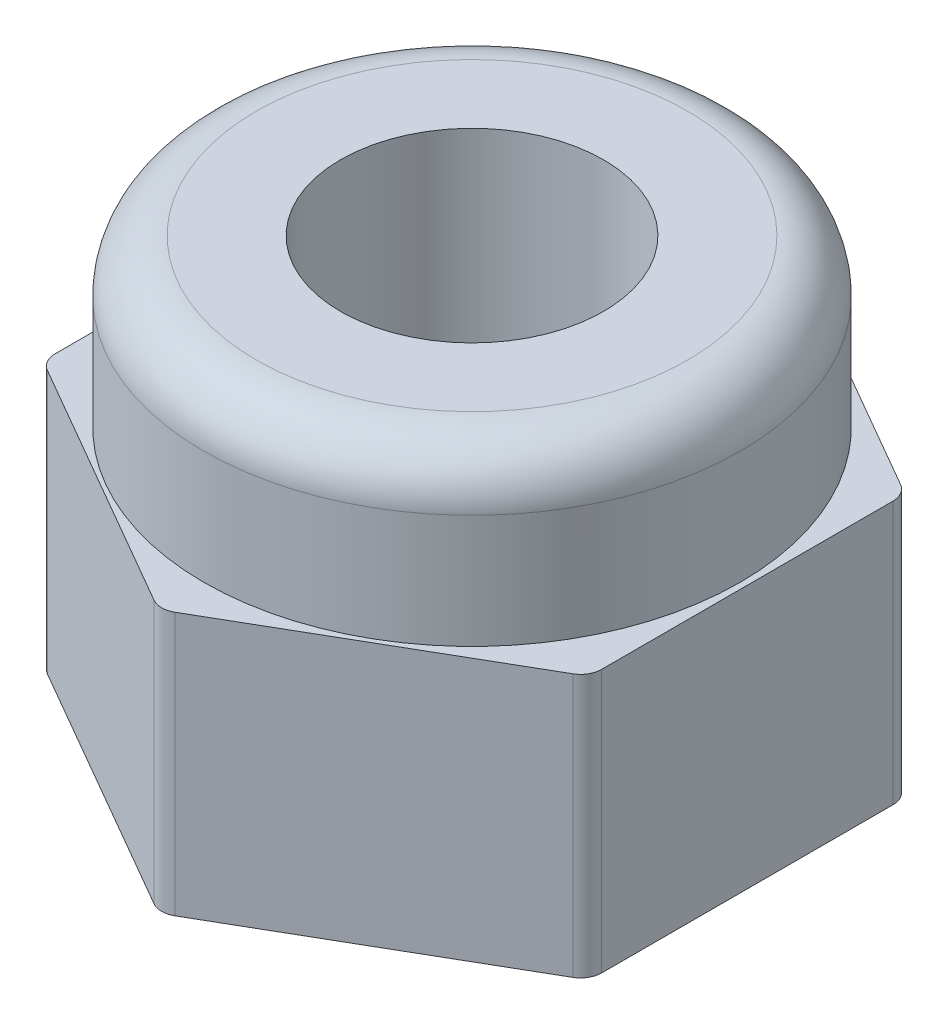
ISO-10303-21;
HEADER;
FILE_DESCRIPTION(('STEP AP214'),'2;1');
FILE_NAME('part.step','',(''),(''),'','','');
FILE_SCHEMA(('AUTOMOTIVE_DESIGN { 1 0 10303 214 1 1 1 1 }'));
ENDSEC;
DATA;
#1=APPLICATION_CONTEXT('core data for automotive mechanical design processes');
#2=APPLICATION_PROTOCOL_DEFINITION('international standard','automotive_design',2000,#1);
#3=PRODUCT_CONTEXT('',#1,'mechanical');
#4=PRODUCT('Part','Part','',(#3));
#5=PRODUCT_RELATED_PRODUCT_CATEGORY('part','',(#4));
#6=PRODUCT_DEFINITION_FORMATION('','',#4);
#7=PRODUCT_DEFINITION_CONTEXT('part definition',#1,'design');
#8=PRODUCT_DEFINITION('design','',#6,#7);
#9=PRODUCT_DEFINITION_SHAPE('','',#8);
#10=(LENGTH_UNIT() NAMED_UNIT(*) SI_UNIT(.MILLI.,.METRE.));
#11=(NAMED_UNIT(*) PLANE_ANGLE_UNIT() SI_UNIT($,.RADIAN.));
#12=(NAMED_UNIT(*) SI_UNIT($,.STERADIAN.) SOLID_ANGLE_UNIT());
#13=UNCERTAINTY_MEASURE_WITH_UNIT(LENGTH_MEASURE(1.E-05),#10,'distance_accuracy_value','');
#14=(GEOMETRIC_REPRESENTATION_CONTEXT(3) GLOBAL_UNCERTAINTY_ASSIGNED_CONTEXT((#13)) GLOBAL_UNIT_ASSIGNED_CONTEXT((#10,
#11,#12)) REPRESENTATION_CONTEXT('',''));
#15=CARTESIAN_POINT('',(0.,0.,0.));
#16=DIRECTION('',(0.,0.,1.));
#17=DIRECTION('',(1.,0.,0.));
#18=AXIS2_PLACEMENT_3D('',#15,#16,#17);
#19=CARTESIAN_POINT('',(2.607520492287,0.,1.490555719066));
#20=DIRECTION('',(-1.,0.,0.));
#21=DIRECTION('',(0.,0.,1.));
#22=AXIS2_PLACEMENT_3D('',#19,#20,#21);
#23=PLANE('',#22);
#24=DIRECTION('',(0.,-1.,0.));
#25=VECTOR('',#24,1.);
#26=CARTESIAN_POINT('',(2.607520492287,2.5,1.375085665228));
#27=LINE('',#26,#25);
#28=CARTESIAN_POINT('',(2.607520492287,2.5,1.375085665228));
#29=VERTEX_POINT('',#28);
#30=CARTESIAN_POINT('',(2.607520492287,0.,1.375085665228));
#31=VERTEX_POINT('',#30);
#32=EDGE_CURVE('E216',#29,#31,#27,.T.);
#33=ORIENTED_EDGE('',*,*,#32,.T.);
#34=DIRECTION('',(0.,0.,-1.));
#35=VECTOR('',#34,1.);
#36=CARTESIAN_POINT('',(2.607520492287,0.,1.375085665228));
#37=LINE('',#36,#35);
#38=CARTESIAN_POINT('',(2.607520492287,0.,-1.393974227096));
#39=VERTEX_POINT('',#38);
#40=EDGE_CURVE('E242',#31,#39,#37,.T.);
#41=ORIENTED_EDGE('',*,*,#40,.T.);
#42=DIRECTION('',(0.,-1.,0.));
#43=VECTOR('',#42,1.);
#44=CARTESIAN_POINT('',(2.607520492287,2.5,-1.393974227096));
#45=LINE('',#44,#43);
#46=CARTESIAN_POINT('',(2.607520492287,2.5,-1.393974227096));
#47=VERTEX_POINT('',#46);
#48=EDGE_CURVE('E11',#47,#39,#45,.T.);
#49=ORIENTED_EDGE('',*,*,#48,.F.);
#50=DIRECTION('',(0.,0.,-1.));
#51=VECTOR('',#50,1.);
#52=CARTESIAN_POINT('',(2.607520492287,2.5,1.375085665228));
#53=LINE('',#52,#51);
#54=EDGE_CURVE('E243',#29,#47,#53,.T.);
#55=ORIENTED_EDGE('',*,*,#54,.F.);
#56=EDGE_LOOP('',(#33,#41,#49,#55));
#57=FACE_BOUND('',#56,.T.);
#58=ADVANCED_FACE('F17',(#57),#23,.F.);
#59=CARTESIAN_POINT('',(2.407520492287,9.398688,-1.393974227096));
#60=DIRECTION('',(0.,-1.,0.));
#61=DIRECTION('',(0.500000000000017,0.,-0.866025403784429));
#62=AXIS2_PLACEMENT_3D('',#59,#60,#61);
#63=CYLINDRICAL_SURFACE('',#62,0.2);
#64=CARTESIAN_POINT('',(2.407520492287,0.,-1.393974227096));
#65=DIRECTION('',(0.,-1.,0.));
#66=DIRECTION('',(0.500000000000017,0.,-0.866025403784429));
#67=AXIS2_PLACEMENT_3D('',#64,#65,#66);
#68=CIRCLE('',#67,0.2);
#69=CARTESIAN_POINT('',(2.507520492287,0.,-1.567179307853));
#70=VERTEX_POINT('',#69);
#71=EDGE_CURVE('E300',#70,#39,#68,.T.);
#72=ORIENTED_EDGE('',*,*,#71,.F.);
#73=DIRECTION('',(0.,-1.,0.));
#74=VECTOR('',#73,1.);
#75=CARTESIAN_POINT('',(2.507520492287,2.5,-1.567179307853));
#76=LINE('',#75,#74);
#77=CARTESIAN_POINT('',(2.507520492287,2.5,-1.567179307853));
#78=VERTEX_POINT('',#77);
#79=EDGE_CURVE('E28',#78,#70,#76,.T.);
#80=ORIENTED_EDGE('',*,*,#79,.F.);
#81=CARTESIAN_POINT('',(2.407520492287,2.5,-1.393974227096));
#82=DIRECTION('',(0.,1.,0.));
#83=DIRECTION('',(1.,0.,0.));
#84=AXIS2_PLACEMENT_3D('',#81,#82,#83);
#85=CIRCLE('',#84,0.2);
#86=EDGE_CURVE('E246',#47,#78,#85,.T.);
#87=ORIENTED_EDGE('',*,*,#86,.F.);
#88=ORIENTED_EDGE('',*,*,#48,.T.);
#89=EDGE_LOOP('',(#72,#80,#87,#88));
#90=FACE_BOUND('',#89,.T.);
#91=ADVANCED_FACE('F358',(#90),#63,.T.);
#92=CARTESIAN_POINT('',(2.607520492287,0.,-1.509444280934));
#93=DIRECTION('',(-0.500000000000017,0.,0.866025403784429));
#94=DIRECTION('',(0.,1.,0.));
#95=AXIS2_PLACEMENT_3D('',#92,#93,#94);
#96=PLANE('',#95);
#97=ORIENTED_EDGE('',*,*,#79,.T.);
#98=DIRECTION('',(-0.866025403784429,0.,-0.500000000000017));
#99=VECTOR('',#98,1.);
#100=CARTESIAN_POINT('',(2.507520492287,0.,-1.567179307853));
#101=LINE('',#100,#99);
#102=CARTESIAN_POINT('',(0.1094442809333,0.,-2.951709254015));
#103=VERTEX_POINT('',#102);
#104=EDGE_CURVE('E273',#70,#103,#101,.T.);
#105=ORIENTED_EDGE('',*,*,#104,.T.);
#106=DIRECTION('',(0.,-1.,0.));
#107=VECTOR('',#106,1.);
#108=CARTESIAN_POINT('',(0.1094442809333,2.5,-2.951709254015));
#109=LINE('',#108,#107);
#110=CARTESIAN_POINT('',(0.1094442809333,2.5,-2.951709254015));
#111=VERTEX_POINT('',#110);
#112=EDGE_CURVE('E235',#111,#103,#109,.T.);
#113=ORIENTED_EDGE('',*,*,#112,.F.);
#114=DIRECTION('',(-0.866025403784429,0.,-0.500000000000017));
#115=VECTOR('',#114,1.);
#116=CARTESIAN_POINT('',(2.507520492287,2.5,-1.567179307853));
#117=LINE('',#116,#115);
#118=EDGE_CURVE('E260',#78,#111,#117,.T.);
#119=ORIENTED_EDGE('',*,*,#118,.F.);
#120=EDGE_LOOP('',(#97,#105,#113,#119));
#121=FACE_BOUND('',#120,.T.);
#122=ADVANCED_FACE('F364',(#121),#96,.F.);
#123=CARTESIAN_POINT('',(0.00944428093334,9.398688,-2.778504173258));
#124=DIRECTION('',(0.,-1.,0.));
#125=DIRECTION('',(-0.500000000000017,0.,-0.866025403784429));
#126=AXIS2_PLACEMENT_3D('',#123,#124,#125);
#127=CYLINDRICAL_SURFACE('',#126,0.2);
#128=CARTESIAN_POINT('',(0.009444280933338,0.,-2.778504173258));
#129=DIRECTION('',(0.,-1.,0.));
#130=DIRECTION('',(-0.500000000000017,0.,-0.866025403784429));
#131=AXIS2_PLACEMENT_3D('',#128,#129,#130);
#132=CIRCLE('',#131,0.2);
#133=CARTESIAN_POINT('',(-0.09055571906666,0.,-2.951709254015));
#134=VERTEX_POINT('',#133);
#135=EDGE_CURVE('E301',#134,#103,#132,.T.);
#136=ORIENTED_EDGE('',*,*,#135,.F.);
#137=DIRECTION('',(0.,-1.,0.));
#138=VECTOR('',#137,1.);
#139=CARTESIAN_POINT('',(-0.09055571906666,2.5,-2.951709254015));
#140=LINE('',#139,#138);
#141=CARTESIAN_POINT('',(-0.09055571906666,2.5,-2.951709254015));
#142=VERTEX_POINT('',#141);
#143=EDGE_CURVE('E215',#142,#134,#140,.T.);
#144=ORIENTED_EDGE('',*,*,#143,.F.);
#145=CARTESIAN_POINT('',(0.009444280933339,2.5,-2.778504173258));
#146=DIRECTION('',(0.,1.,0.));
#147=DIRECTION('',(0.500000000000017,0.,-0.866025403784429));
#148=AXIS2_PLACEMENT_3D('',#145,#146,#147);
#149=CIRCLE('',#148,0.2);
#150=EDGE_CURVE('E193',#111,#142,#149,.T.);
#151=ORIENTED_EDGE('',*,*,#150,.F.);
#152=ORIENTED_EDGE('',*,*,#112,.T.);
#153=EDGE_LOOP('',(#136,#144,#151,#152));
#154=FACE_BOUND('',#153,.T.);
#155=ADVANCED_FACE('F378',(#154),#127,.T.);
#156=CARTESIAN_POINT('',(0.009444280933338,0.,-3.009444280934));
#157=DIRECTION('',(0.500000000000017,0.,0.866025403784429));
#158=DIRECTION('',(0.,-1.,0.));
#159=AXIS2_PLACEMENT_3D('',#156,#157,#158);
#160=PLANE('',#159);
#161=ORIENTED_EDGE('',*,*,#143,.T.);
#162=DIRECTION('',(-0.866025403784429,0.,0.500000000000017));
#163=VECTOR('',#162,1.);
#164=CARTESIAN_POINT('',(-0.09055571906666,0.,-2.951709254015));
#165=LINE('',#164,#163);
#166=CARTESIAN_POINT('',(-2.48863193042,0.,-1.567179307853));
#167=VERTEX_POINT('',#166);
#168=EDGE_CURVE('E305',#134,#167,#165,.T.);
#169=ORIENTED_EDGE('',*,*,#168,.T.);
#170=DIRECTION('',(0.,-1.,0.));
#171=VECTOR('',#170,1.);
#172=CARTESIAN_POINT('',(-2.48863193042,2.5,-1.567179307853));
#173=LINE('',#172,#171);
#174=CARTESIAN_POINT('',(-2.48863193042,2.5,-1.567179307853));
#175=VERTEX_POINT('',#174);
#176=EDGE_CURVE('E172',#175,#167,#173,.T.);
#177=ORIENTED_EDGE('',*,*,#176,.F.);
#178=DIRECTION('',(-0.866025403784429,0.,0.500000000000017));
#179=VECTOR('',#178,1.);
#180=CARTESIAN_POINT('',(-0.09055571906666,2.5,-2.951709254015));
#181=LINE('',#180,#179);
#182=EDGE_CURVE('E186',#142,#175,#181,.T.);
#183=ORIENTED_EDGE('',*,*,#182,.F.);
#184=EDGE_LOOP('',(#161,#169,#177,#183));
#185=FACE_BOUND('',#184,.T.);
#186=ADVANCED_FACE('F381',(#185),#160,.F.);
#187=CARTESIAN_POINT('',(-2.38863193042,9.398688,-1.393974227096));
#188=DIRECTION('',(0.,-1.,0.));
#189=DIRECTION('',(-1.,0.,0.));
#190=AXIS2_PLACEMENT_3D('',#187,#188,#189);
#191=CYLINDRICAL_SURFACE('',#190,0.2);
#192=CARTESIAN_POINT('',(-2.38863193042,0.,-1.393974227096));
#193=DIRECTION('',(0.,-1.,0.));
#194=DIRECTION('',(-1.,0.,0.));
#195=AXIS2_PLACEMENT_3D('',#192,#193,#194);
#196=CIRCLE('',#195,0.2);
#197=CARTESIAN_POINT('',(-2.58863193042,0.,-1.393974227096));
#198=VERTEX_POINT('',#197);
#199=EDGE_CURVE('E21',#198,#167,#196,.T.);
#200=ORIENTED_EDGE('',*,*,#199,.F.);
#201=DIRECTION('',(0.,-1.,0.));
#202=VECTOR('',#201,1.);
#203=CARTESIAN_POINT('',(-2.58863193042,2.5,-1.393974227096));
#204=LINE('',#203,#202);
#205=CARTESIAN_POINT('',(-2.58863193042,2.5,-1.393974227096));
#206=VERTEX_POINT('',#205);
#207=EDGE_CURVE('E164',#206,#198,#204,.T.);
#208=ORIENTED_EDGE('',*,*,#207,.F.);
#209=CARTESIAN_POINT('',(-2.38863193042,2.5,-1.393974227096));
#210=DIRECTION('',(0.,1.,0.));
#211=DIRECTION('',(-0.500000000000017,0.,-0.866025403784429));
#212=AXIS2_PLACEMENT_3D('',#209,#210,#211);
#213=CIRCLE('',#212,0.2);
#214=EDGE_CURVE('E167',#175,#206,#213,.T.);
#215=ORIENTED_EDGE('',*,*,#214,.F.);
#216=ORIENTED_EDGE('',*,*,#176,.T.);
#217=EDGE_LOOP('',(#200,#208,#215,#216));
#218=FACE_BOUND('',#217,.T.);
#219=ADVANCED_FACE('F165',(#218),#191,.T.);
#220=CARTESIAN_POINT('',(-2.58863193042,0.,-1.509444280934));
#221=DIRECTION('',(1.,0.,0.));
#222=DIRECTION('',(0.,1.,0.));
#223=AXIS2_PLACEMENT_3D('',#220,#221,#222);
#224=PLANE('',#223);
#225=ORIENTED_EDGE('',*,*,#207,.T.);
#226=DIRECTION('',(0.,0.,1.));
#227=VECTOR('',#226,1.);
#228=CARTESIAN_POINT('',(-2.58863193042,0.,-1.393974227096));
#229=LINE('',#228,#227);
#230=CARTESIAN_POINT('',(-2.58863193042,0.,1.375085665228));
#231=VERTEX_POINT('',#230);
#232=EDGE_CURVE('E276',#198,#231,#229,.T.);
#233=ORIENTED_EDGE('',*,*,#232,.T.);
#234=DIRECTION('',(0.,-1.,0.));
#235=VECTOR('',#234,1.);
#236=CARTESIAN_POINT('',(-2.58863193042,2.5,1.375085665228));
#237=LINE('',#236,#235);
#238=CARTESIAN_POINT('',(-2.58863193042,2.5,1.375085665228));
#239=VERTEX_POINT('',#238);
#240=EDGE_CURVE('E153',#239,#231,#237,.T.);
#241=ORIENTED_EDGE('',*,*,#240,.F.);
#242=DIRECTION('',(0.,0.,1.));
#243=VECTOR('',#242,1.);
#244=CARTESIAN_POINT('',(-2.58863193042,2.5,-1.393974227096));
#245=LINE('',#244,#243);
#246=EDGE_CURVE('E175',#206,#239,#245,.T.);
#247=ORIENTED_EDGE('',*,*,#246,.F.);
#248=EDGE_LOOP('',(#225,#233,#241,#247));
#249=FACE_BOUND('',#248,.T.);
#250=ADVANCED_FACE('F176',(#249),#224,.F.);
#251=CARTESIAN_POINT('',(-2.38863193042,9.398688,1.375085665228));
#252=DIRECTION('',(0.,-1.,0.));
#253=DIRECTION('',(-0.500000000000017,0.,0.866025403784429));
#254=AXIS2_PLACEMENT_3D('',#251,#252,#253);
#255=CYLINDRICAL_SURFACE('',#254,0.2);
#256=CARTESIAN_POINT('',(-2.38863193042,0.,1.375085665228));
#257=DIRECTION('',(0.,-1.,0.));
#258=DIRECTION('',(-0.500000000000017,0.,0.866025403784429));
#259=AXIS2_PLACEMENT_3D('',#256,#257,#258);
#260=CIRCLE('',#259,0.2);
#261=CARTESIAN_POINT('',(-2.48863193042,0.,1.548290745985));
#262=VERTEX_POINT('',#261);
#263=EDGE_CURVE('E252',#262,#231,#260,.T.);
#264=ORIENTED_EDGE('',*,*,#263,.F.);
#265=DIRECTION('',(0.,-1.,0.));
#266=VECTOR('',#265,1.);
#267=CARTESIAN_POINT('',(-2.48863193042,2.5,1.548290745985));
#268=LINE('',#267,#266);
#269=CARTESIAN_POINT('',(-2.48863193042,2.5,1.548290745985));
#270=VERTEX_POINT('',#269);
#271=EDGE_CURVE('E206',#270,#262,#268,.T.);
#272=ORIENTED_EDGE('',*,*,#271,.F.);
#273=CARTESIAN_POINT('',(-2.38863193042,2.5,1.375085665228));
#274=DIRECTION('',(0.,1.,0.));
#275=DIRECTION('',(-1.,0.,0.));
#276=AXIS2_PLACEMENT_3D('',#273,#274,#275);
#277=CIRCLE('',#276,0.2);
#278=EDGE_CURVE('E180',#239,#270,#277,.T.);
#279=ORIENTED_EDGE('',*,*,#278,.F.);
#280=ORIENTED_EDGE('',*,*,#240,.T.);
#281=EDGE_LOOP('',(#264,#272,#279,#280));
#282=FACE_BOUND('',#281,.T.);
#283=ADVANCED_FACE('F346',(#282),#255,.T.);
#284=CARTESIAN_POINT('',(-2.58863193042,0.,1.490555719066));
#285=DIRECTION('',(0.500000000000017,0.,-0.866025403784429));
#286=DIRECTION('',(0.,-1.,0.));
#287=AXIS2_PLACEMENT_3D('',#284,#285,#286);
#288=PLANE('',#287);
#289=ORIENTED_EDGE('',*,*,#271,.T.);
#290=DIRECTION('',(0.866025403784429,0.,0.500000000000017));
#291=VECTOR('',#290,1.);
#292=CARTESIAN_POINT('',(-2.48863193042,0.,1.548290745985));
#293=LINE('',#292,#291);
#294=CARTESIAN_POINT('',(-0.09055571906666,0.,2.932820692147));
#295=VERTEX_POINT('',#294);
#296=EDGE_CURVE('E248',#262,#295,#293,.T.);
#297=ORIENTED_EDGE('',*,*,#296,.T.);
#298=DIRECTION('',(0.,-1.,0.));
#299=VECTOR('',#298,1.);
#300=CARTESIAN_POINT('',(-0.09055571906666,2.5,2.932820692147));
#301=LINE('',#300,#299);
#302=CARTESIAN_POINT('',(-0.09055571906666,2.5,2.932820692147));
#303=VERTEX_POINT('',#302);
#304=EDGE_CURVE('E204',#303,#295,#301,.T.);
#305=ORIENTED_EDGE('',*,*,#304,.F.);
#306=DIRECTION('',(0.866025403784429,0.,0.500000000000017));
#307=VECTOR('',#306,1.);
#308=CARTESIAN_POINT('',(-2.48863193042,2.5,1.548290745985));
#309=LINE('',#308,#307);
#310=EDGE_CURVE('E201',#270,#303,#309,.T.);
#311=ORIENTED_EDGE('',*,*,#310,.F.);
#312=EDGE_LOOP('',(#289,#297,#305,#311));
#313=FACE_BOUND('',#312,.T.);
#314=ADVANCED_FACE('F19',(#313),#288,.F.);
#315=CARTESIAN_POINT('',(0.00944428093334,9.398688,2.75961561139));
#316=DIRECTION('',(0.,-1.,0.));
#317=DIRECTION('',(0.500000000000017,0.,0.866025403784429));
#318=AXIS2_PLACEMENT_3D('',#315,#316,#317);
#319=CYLINDRICAL_SURFACE('',#318,0.2);
#320=CARTESIAN_POINT('',(0.009444280933338,0.,2.75961561139));
#321=DIRECTION('',(0.,-1.,0.));
#322=DIRECTION('',(0.500000000000017,0.,0.866025403784429));
#323=AXIS2_PLACEMENT_3D('',#320,#321,#322);
#324=CIRCLE('',#323,0.2);
#325=CARTESIAN_POINT('',(0.1094442809333,0.,2.932820692147));
#326=VERTEX_POINT('',#325);
#327=EDGE_CURVE('E253',#326,#295,#324,.T.);
#328=ORIENTED_EDGE('',*,*,#327,.F.);
#329=DIRECTION('',(0.,-1.,0.));
#330=VECTOR('',#329,1.);
#331=CARTESIAN_POINT('',(0.1094442809333,2.5,2.932820692147));
#332=LINE('',#331,#330);
#333=CARTESIAN_POINT('',(0.1094442809333,2.5,2.932820692147));
#334=VERTEX_POINT('',#333);
#335=EDGE_CURVE('E42',#334,#326,#332,.T.);
#336=ORIENTED_EDGE('',*,*,#335,.F.);
#337=CARTESIAN_POINT('',(0.009444280933339,2.5,2.75961561139));
#338=DIRECTION('',(0.,1.,0.));
#339=DIRECTION('',(-0.500000000000017,0.,0.866025403784429));
#340=AXIS2_PLACEMENT_3D('',#337,#338,#339);
#341=CIRCLE('',#340,0.2);
#342=EDGE_CURVE('E224',#303,#334,#341,.T.);
#343=ORIENTED_EDGE('',*,*,#342,.F.);
#344=ORIENTED_EDGE('',*,*,#304,.T.);
#345=EDGE_LOOP('',(#328,#336,#343,#344));
#346=FACE_BOUND('',#345,.T.);
#347=ADVANCED_FACE('F341',(#346),#319,.T.);
#348=CARTESIAN_POINT('',(0.009444280933338,0.,2.990555719066));
#349=DIRECTION('',(-0.500000000000017,0.,-0.866025403784429));
#350=DIRECTION('',(-0.866025403784429,0.,0.500000000000017));
#351=AXIS2_PLACEMENT_3D('',#348,#349,#350);
#352=PLANE('',#351);
#353=DIRECTION('',(0.,-1.,0.));
#354=VECTOR('',#353,1.);
#355=CARTESIAN_POINT('',(2.507520492287,2.5,1.548290745985));
#356=LINE('',#355,#354);
#357=CARTESIAN_POINT('',(2.507520492287,2.5,1.548290745985));
#358=VERTEX_POINT('',#357);
#359=CARTESIAN_POINT('',(2.507520492287,0.,1.548290745985));
#360=VERTEX_POINT('',#359);
#361=EDGE_CURVE('E205',#358,#360,#356,.T.);
#362=ORIENTED_EDGE('',*,*,#361,.F.);
#363=DIRECTION('',(0.866025403784429,0.,-0.500000000000017));
#364=VECTOR('',#363,1.);
#365=CARTESIAN_POINT('',(0.1094442809333,2.5,2.932820692147));
#366=LINE('',#365,#364);
#367=EDGE_CURVE('E220',#334,#358,#366,.T.);
#368=ORIENTED_EDGE('',*,*,#367,.F.);
#369=ORIENTED_EDGE('',*,*,#335,.T.);
#370=DIRECTION('',(0.866025403784429,0.,-0.500000000000017));
#371=VECTOR('',#370,1.);
#372=CARTESIAN_POINT('',(0.1094442809333,0.,2.932820692147));
#373=LINE('',#372,#371);
#374=EDGE_CURVE('E282',#326,#360,#373,.T.);
#375=ORIENTED_EDGE('',*,*,#374,.T.);
#376=EDGE_LOOP('',(#362,#368,#369,#375));
#377=FACE_BOUND('',#376,.T.);
#378=ADVANCED_FACE('F339',(#377),#352,.F.);
#379=CARTESIAN_POINT('',(2.407520492287,9.398688,1.375085665228));
#380=DIRECTION('',(0.,-1.,0.));
#381=DIRECTION('',(1.,0.,0.));
#382=AXIS2_PLACEMENT_3D('',#379,#380,#381);
#383=CYLINDRICAL_SURFACE('',#382,0.2);
#384=CARTESIAN_POINT('',(2.407520492287,0.,1.375085665228));
#385=DIRECTION('',(0.,-1.,0.));
#386=DIRECTION('',(1.,0.,0.));
#387=AXIS2_PLACEMENT_3D('',#384,#385,#386);
#388=CIRCLE('',#387,0.2);
#389=EDGE_CURVE('E290',#31,#360,#388,.T.);
#390=ORIENTED_EDGE('',*,*,#389,.F.);
#391=ORIENTED_EDGE('',*,*,#32,.F.);
#392=CARTESIAN_POINT('',(2.407520492287,2.5,1.375085665228));
#393=DIRECTION('',(0.,1.,0.));
#394=DIRECTION('',(0.500000000000017,0.,0.866025403784429));
#395=AXIS2_PLACEMENT_3D('',#392,#393,#394);
#396=CIRCLE('',#395,0.2);
#397=EDGE_CURVE('E197',#358,#29,#396,.T.);
#398=ORIENTED_EDGE('',*,*,#397,.F.);
#399=ORIENTED_EDGE('',*,*,#361,.T.);
#400=EDGE_LOOP('',(#390,#391,#398,#399));
#401=FACE_BOUND('',#400,.T.);
#402=ADVANCED_FACE('F338',(#401),#383,.T.);
#403=CARTESIAN_POINT('',(0.,2.5,0.));
#404=DIRECTION('',(0.,-1.,0.));
#405=DIRECTION('',(0.,0.,-1.));
#406=AXIS2_PLACEMENT_3D('',#403,#404,#405);
#407=PLANE('',#406);
#408=CARTESIAN_POINT('',(0.,2.5,0.));
#409=DIRECTION('',(0.,-1.,0.));
#410=DIRECTION('',(1.,0.,0.));
#411=AXIS2_PLACEMENT_3D('',#408,#409,#410);
#412=CIRCLE('',#411,2.55);
#413=CARTESIAN_POINT('',(2.55,2.5,0.));
#414=VERTEX_POINT('',#413);
#415=EDGE_CURVE('E211',#414,#414,#412,.T.);
#416=ORIENTED_EDGE('',*,*,#415,.T.);
#417=EDGE_LOOP('',(#416));
#418=FACE_BOUND('',#417,.T.);
#419=ORIENTED_EDGE('',*,*,#397,.T.);
#420=ORIENTED_EDGE('',*,*,#54,.T.);
#421=ORIENTED_EDGE('',*,*,#86,.T.);
#422=ORIENTED_EDGE('',*,*,#118,.T.);
#423=ORIENTED_EDGE('',*,*,#150,.T.);
#424=ORIENTED_EDGE('',*,*,#182,.T.);
#425=ORIENTED_EDGE('',*,*,#214,.T.);
#426=ORIENTED_EDGE('',*,*,#246,.T.);
#427=ORIENTED_EDGE('',*,*,#278,.T.);
#428=ORIENTED_EDGE('',*,*,#310,.T.);
#429=ORIENTED_EDGE('',*,*,#342,.T.);
#430=ORIENTED_EDGE('',*,*,#367,.T.);
#431=EDGE_LOOP('',(#419,#420,#421,#422,#423,#424,#425,#426,#427,#428,#429,#430));
#432=FACE_BOUND('',#431,.T.);
#433=ADVANCED_FACE('F183',(#418,#432),#407,.F.);
#434=CARTESIAN_POINT('',(0.,4.284,0.));
#435=DIRECTION('',(0.,-1.,0.));
#436=DIRECTION('',(-1.,0.,0.));
#437=AXIS2_PLACEMENT_3D('',#434,#435,#436);
#438=CYLINDRICAL_SURFACE('',#437,2.55);
#439=ORIENTED_EDGE('',*,*,#415,.F.);
#440=DIRECTION('',(0.,1.,0.));
#441=VECTOR('',#440,1.);
#442=CARTESIAN_POINT('',(2.55,4.284,0.));
#443=LINE('',#442,#441);
#444=CARTESIAN_POINT('',(2.55,3.58,0.));
#445=VERTEX_POINT('',#444);
#446=EDGE_CURVE('E230',#414,#445,#443,.T.);
#447=ORIENTED_EDGE('',*,*,#446,.T.);
#448=CARTESIAN_POINT('',(0.,3.58,0.));
#449=DIRECTION('',(0.,1.,0.));
#450=DIRECTION('',(1.,0.,0.));
#451=AXIS2_PLACEMENT_3D('',#448,#449,#450);
#452=CIRCLE('',#451,2.55);
#453=CARTESIAN_POINT('',(-2.54991013060307,3.58,-0.0214085461401948));
#454=VERTEX_POINT('',#453);
#455=EDGE_CURVE('E257',#454,#445,#452,.T.);
#456=ORIENTED_EDGE('',*,*,#455,.F.);
#457=CARTESIAN_POINT('',(0.,3.58,0.));
#458=DIRECTION('',(0.,1.,0.));
#459=DIRECTION('',(1.,0.,0.));
#460=AXIS2_PLACEMENT_3D('',#457,#458,#459);
#461=CIRCLE('',#460,2.55);
#462=EDGE_CURVE('E212',#445,#454,#461,.T.);
#463=ORIENTED_EDGE('',*,*,#462,.F.);
#464=ORIENTED_EDGE('',*,*,#446,.F.);
#465=EDGE_LOOP('',(#439,#447,#456,#463,#464));
#466=FACE_BOUND('',#465,.T.);
#467=ADVANCED_FACE('F370',(#466),#438,.T.);
#468=CARTESIAN_POINT('',(0.,3.58,0.));
#469=DIRECTION('',(0.,-1.,0.));
#470=DIRECTION('',(0.999964757099243,0.,0.00839550829027236));
#471=AXIS2_PLACEMENT_3D('',#468,#469,#470);
#472=TOROIDAL_SURFACE('',#471,2.05,0.5);
#473=ORIENTED_EDGE('',*,*,#455,.T.);
#474=ORIENTED_EDGE('',*,*,#462,.T.);
#475=CARTESIAN_POINT('',(-2.04992775205345,3.58,-0.0172107919950586));
#476=DIRECTION('',(0.00839550829027248,0.,-0.999964757099243));
#477=DIRECTION('',(-0.999964757099243,0.,-0.00839550829027248));
#478=AXIS2_PLACEMENT_3D('',#475,#476,#477);
#479=CIRCLE('',#478,0.5);
#480=CARTESIAN_POINT('',(-2.04992775205345,4.08,-0.0172107919950586));
#481=VERTEX_POINT('',#480);
#482=EDGE_CURVE('E129',#454,#481,#479,.T.);
#483=ORIENTED_EDGE('',*,*,#482,.T.);
#484=CARTESIAN_POINT('',(0.,4.08,0.));
#485=DIRECTION('',(0.,1.,0.));
#486=DIRECTION('',(1.,0.,0.));
#487=AXIS2_PLACEMENT_3D('',#484,#485,#486);
#488=CIRCLE('',#487,2.05);
#489=EDGE_CURVE('E228',#481,#481,#488,.T.);
#490=ORIENTED_EDGE('',*,*,#489,.F.);
#491=ORIENTED_EDGE('',*,*,#482,.F.);
#492=EDGE_LOOP('',(#473,#474,#483,#490,#491));
#493=FACE_BOUND('',#492,.T.);
#494=ADVANCED_FACE('F373',(#493),#472,.T.);
#495=CARTESIAN_POINT('',(0.,4.08,0.));
#496=DIRECTION('',(0.,-1.,0.));
#497=DIRECTION('',(0.,0.,-1.));
#498=AXIS2_PLACEMENT_3D('',#495,#496,#497);
#499=PLANE('',#498);
#500=CARTESIAN_POINT('',(0.,4.08,0.));
#501=DIRECTION('',(0.,1.,0.));
#502=DIRECTION('',(1.,0.,0.));
#503=AXIS2_PLACEMENT_3D('',#500,#501,#502);
#504=CIRCLE('',#503,1.25);
#505=CARTESIAN_POINT('',(-1.25,4.08,0.));
#506=VERTEX_POINT('',#505);
#507=EDGE_CURVE('E225',#506,#506,#504,.T.);
#508=ORIENTED_EDGE('',*,*,#507,.F.);
#509=EDGE_LOOP('',(#508));
#510=FACE_BOUND('',#509,.T.);
#511=ORIENTED_EDGE('',*,*,#489,.T.);
#512=EDGE_LOOP('',(#511));
#513=FACE_BOUND('',#512,.T.);
#514=ADVANCED_FACE('F387',(#510,#513),#499,.F.);
#515=CARTESIAN_POINT('',(0.,-0.6324,0.));
#516=DIRECTION('',(0.,1.,0.));
#517=DIRECTION('',(1.,0.,0.));
#518=AXIS2_PLACEMENT_3D('',#515,#516,#517);
#519=CYLINDRICAL_SURFACE('',#518,1.25);
#520=CARTESIAN_POINT('',(0.,0.,0.));
#521=DIRECTION('',(0.,1.,0.));
#522=DIRECTION('',(1.,0.,0.));
#523=AXIS2_PLACEMENT_3D('',#520,#521,#522);
#524=CIRCLE('',#523,1.25);
#525=CARTESIAN_POINT('',(-1.25,0.,0.));
#526=VERTEX_POINT('',#525);
#527=EDGE_CURVE('E238',#526,#526,#524,.T.);
#528=ORIENTED_EDGE('',*,*,#527,.F.);
#529=DIRECTION('',(0.,1.,0.));
#530=VECTOR('',#529,1.);
#531=CARTESIAN_POINT('',(-1.25,-0.6324,0.));
#532=LINE('',#531,#530);
#533=EDGE_CURVE('E229',#526,#506,#532,.T.);
#534=ORIENTED_EDGE('',*,*,#533,.T.);
#535=ORIENTED_EDGE('',*,*,#507,.T.);
#536=ORIENTED_EDGE('',*,*,#533,.F.);
#537=EDGE_LOOP('',(#528,#534,#535,#536));
#538=FACE_BOUND('',#537,.T.);
#539=ADVANCED_FACE('F392',(#538),#519,.F.);
#540=CARTESIAN_POINT('',(0.,0.,0.));
#541=DIRECTION('',(0.,-1.,0.));
#542=DIRECTION('',(0.,0.,-1.));
#543=AXIS2_PLACEMENT_3D('',#540,#541,#542);
#544=PLANE('',#543);
#545=ORIENTED_EDGE('',*,*,#527,.T.);
#546=EDGE_LOOP('',(#545));
#547=FACE_BOUND('',#546,.T.);
#548=ORIENTED_EDGE('',*,*,#389,.T.);
#549=ORIENTED_EDGE('',*,*,#374,.F.);
#550=ORIENTED_EDGE('',*,*,#327,.T.);
#551=ORIENTED_EDGE('',*,*,#296,.F.);
#552=ORIENTED_EDGE('',*,*,#263,.T.);
#553=ORIENTED_EDGE('',*,*,#232,.F.);
#554=ORIENTED_EDGE('',*,*,#199,.T.);
#555=ORIENTED_EDGE('',*,*,#168,.F.);
#556=ORIENTED_EDGE('',*,*,#135,.T.);
#557=ORIENTED_EDGE('',*,*,#104,.F.);
#558=ORIENTED_EDGE('',*,*,#71,.T.);
#559=ORIENTED_EDGE('',*,*,#40,.F.);
#560=EDGE_LOOP('',(#548,#549,#550,#551,#552,#553,#554,#555,#556,#557,#558,#559));
#561=FACE_BOUND('',#560,.T.);
#562=ADVANCED_FACE('F344',(#547,#561),#544,.T.);
#563=CLOSED_SHELL('',(#58,#91,#122,#155,#186,#219,#250,#283,#314,#347,#378,#402,#433,#467,#494,
#514,#539,#562));
#564=MANIFOLD_SOLID_BREP('B1',#563);
#565=ADVANCED_BREP_SHAPE_REPRESENTATION('',(#18,#564),#14);
#566=SHAPE_DEFINITION_REPRESENTATION(#9,#565);
ENDSEC;
END-ISO-10303-21;
